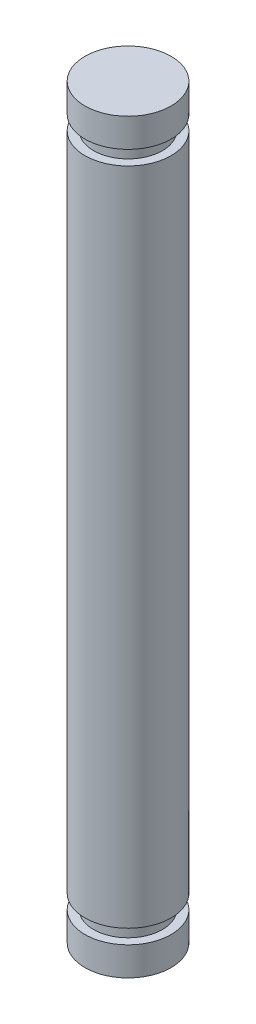
ISO-10303-21;
HEADER;
FILE_DESCRIPTION(('STEP AP214'),'2;1');
FILE_NAME('part.step','',(''),(''),'','','');
FILE_SCHEMA(('AUTOMOTIVE_DESIGN { 1 0 10303 214 1 1 1 1 }'));
ENDSEC;
DATA;
#1=APPLICATION_CONTEXT('core data for automotive mechanical design processes');
#2=APPLICATION_PROTOCOL_DEFINITION('international standard','automotive_design',2000,#1);
#3=PRODUCT_CONTEXT('',#1,'mechanical');
#4=PRODUCT('Part','Part','',(#3));
#5=PRODUCT_RELATED_PRODUCT_CATEGORY('part','',(#4));
#6=PRODUCT_DEFINITION_FORMATION('','',#4);
#7=PRODUCT_DEFINITION_CONTEXT('part definition',#1,'design');
#8=PRODUCT_DEFINITION('design','',#6,#7);
#9=PRODUCT_DEFINITION_SHAPE('','',#8);
#10=(LENGTH_UNIT() NAMED_UNIT(*) SI_UNIT(.MILLI.,.METRE.));
#11=(NAMED_UNIT(*) PLANE_ANGLE_UNIT() SI_UNIT($,.RADIAN.));
#12=(NAMED_UNIT(*) SI_UNIT($,.STERADIAN.) SOLID_ANGLE_UNIT());
#13=UNCERTAINTY_MEASURE_WITH_UNIT(LENGTH_MEASURE(1.E-05),#10,'distance_accuracy_value','');
#14=(GEOMETRIC_REPRESENTATION_CONTEXT(3) GLOBAL_UNCERTAINTY_ASSIGNED_CONTEXT((#13)) GLOBAL_UNIT_ASSIGNED_CONTEXT((#10,
#11,#12)) REPRESENTATION_CONTEXT('',''));
#15=CARTESIAN_POINT('',(0.,0.,0.));
#16=DIRECTION('',(0.,0.,1.));
#17=DIRECTION('',(1.,0.,0.));
#18=AXIS2_PLACEMENT_3D('',#15,#16,#17);
#19=CARTESIAN_POINT('',(0.,26.,0.));
#20=DIRECTION('',(0.,-1.,0.));
#21=DIRECTION('',(0.,0.,-1.));
#22=AXIS2_PLACEMENT_3D('',#19,#20,#21);
#23=CYLINDRICAL_SURFACE('',#22,1.5);
#24=CARTESIAN_POINT('',(0.,1.5,0.));
#25=DIRECTION('',(0.,-1.,0.));
#26=DIRECTION('',(0.,0.,-1.));
#27=AXIS2_PLACEMENT_3D('',#24,#25,#26);
#28=CIRCLE('',#27,1.5);
#29=CARTESIAN_POINT('',(0.,1.5,-1.5));
#30=VERTEX_POINT('',#29);
#31=EDGE_CURVE('E58',#30,#30,#28,.T.);
#32=CARTESIAN_POINT('',(0.,24.5,0.));
#33=DIRECTION('',(0.,1.,0.));
#34=DIRECTION('',(0.,0.,1.));
#35=AXIS2_PLACEMENT_3D('',#32,#33,#34);
#36=CIRCLE('',#35,1.5);
#37=CARTESIAN_POINT('',(0.,24.5,-1.5));
#38=VERTEX_POINT('',#37);
#39=EDGE_CURVE('E49',#38,#38,#36,.T.);
#40=CARTESIAN_POINT('',(0.,1.5,-1.5));
#41=CARTESIAN_POINT('',(0.,1.73958333333334,-1.5));
#42=CARTESIAN_POINT('',(0.,1.97916666666667,-1.5));
#43=CARTESIAN_POINT('',(0.,2.45833333333334,-1.5));
#44=CARTESIAN_POINT('',(0.,2.69791666666667,-1.5));
#45=CARTESIAN_POINT('',(0.,3.17708333333334,-1.5));
#46=CARTESIAN_POINT('',(0.,3.41666666666667,-1.5));
#47=CARTESIAN_POINT('',(0.,3.89583333333333,-1.5));
#48=CARTESIAN_POINT('',(0.,4.13541666666667,-1.5));
#49=CARTESIAN_POINT('',(0.,4.61458333333333,-1.5));
#50=CARTESIAN_POINT('',(0.,4.85416666666667,-1.5));
#51=CARTESIAN_POINT('',(0.,5.33333333333333,-1.5));
#52=CARTESIAN_POINT('',(0.,5.57291666666667,-1.5));
#53=CARTESIAN_POINT('',(0.,6.05208333333334,-1.5));
#54=CARTESIAN_POINT('',(0.,6.29166666666667,-1.5));
#55=CARTESIAN_POINT('',(0.,6.77083333333333,-1.5));
#56=CARTESIAN_POINT('',(0.,7.01041666666667,-1.5));
#57=CARTESIAN_POINT('',(0.,7.48958333333333,-1.5));
#58=CARTESIAN_POINT('',(0.,7.72916666666667,-1.5));
#59=CARTESIAN_POINT('',(0.,8.20833333333333,-1.5));
#60=CARTESIAN_POINT('',(0.,8.44791666666667,-1.5));
#61=CARTESIAN_POINT('',(0.,8.92708333333333,-1.5));
#62=CARTESIAN_POINT('',(0.,9.16666666666667,-1.5));
#63=CARTESIAN_POINT('',(0.,9.64583333333333,-1.5));
#64=CARTESIAN_POINT('',(0.,9.88541666666667,-1.5));
#65=CARTESIAN_POINT('',(0.,10.3645833333333,-1.5));
#66=CARTESIAN_POINT('',(0.,10.6041666666667,-1.5));
#67=CARTESIAN_POINT('',(0.,11.0833333333333,-1.5));
#68=CARTESIAN_POINT('',(0.,11.3229166666667,-1.5));
#69=CARTESIAN_POINT('',(0.,11.8020833333333,-1.5));
#70=CARTESIAN_POINT('',(0.,12.0416666666667,-1.5));
#71=CARTESIAN_POINT('',(0.,12.5208333333333,-1.5));
#72=CARTESIAN_POINT('',(0.,12.7604166666667,-1.5));
#73=CARTESIAN_POINT('',(0.,13.2395833333333,-1.5));
#74=CARTESIAN_POINT('',(0.,13.4791666666667,-1.5));
#75=CARTESIAN_POINT('',(0.,13.9583333333333,-1.5));
#76=CARTESIAN_POINT('',(0.,14.1979166666667,-1.5));
#77=CARTESIAN_POINT('',(0.,14.6770833333333,-1.5));
#78=CARTESIAN_POINT('',(0.,14.9166666666667,-1.5));
#79=CARTESIAN_POINT('',(0.,15.3958333333333,-1.5));
#80=CARTESIAN_POINT('',(0.,15.6354166666667,-1.5));
#81=CARTESIAN_POINT('',(0.,16.1145833333333,-1.5));
#82=CARTESIAN_POINT('',(0.,16.3541666666667,-1.5));
#83=CARTESIAN_POINT('',(0.,16.8333333333333,-1.5));
#84=CARTESIAN_POINT('',(0.,17.0729166666667,-1.5));
#85=CARTESIAN_POINT('',(0.,17.5520833333333,-1.5));
#86=CARTESIAN_POINT('',(0.,17.7916666666667,-1.5));
#87=CARTESIAN_POINT('',(0.,18.2708333333333,-1.5));
#88=CARTESIAN_POINT('',(0.,18.5104166666667,-1.5));
#89=CARTESIAN_POINT('',(0.,18.9895833333333,-1.5));
#90=CARTESIAN_POINT('',(0.,19.2291666666667,-1.5));
#91=CARTESIAN_POINT('',(0.,19.7083333333333,-1.5));
#92=CARTESIAN_POINT('',(0.,19.9479166666667,-1.5));
#93=CARTESIAN_POINT('',(0.,20.4270833333333,-1.5));
#94=CARTESIAN_POINT('',(0.,20.6666666666667,-1.5));
#95=CARTESIAN_POINT('',(0.,21.1458333333333,-1.5));
#96=CARTESIAN_POINT('',(0.,21.3854166666667,-1.5));
#97=CARTESIAN_POINT('',(0.,21.8645833333333,-1.5));
#98=CARTESIAN_POINT('',(0.,22.1041666666667,-1.5));
#99=CARTESIAN_POINT('',(0.,22.5833333333333,-1.5));
#100=CARTESIAN_POINT('',(0.,22.8229166666667,-1.5));
#101=CARTESIAN_POINT('',(0.,23.3020833333333,-1.5));
#102=CARTESIAN_POINT('',(0.,23.5416666666667,-1.5));
#103=CARTESIAN_POINT('',(0.,24.0208333333333,-1.5));
#104=CARTESIAN_POINT('',(0.,24.2604166666667,-1.5));
#105=CARTESIAN_POINT('',(0.,24.5,-1.5));
#106=B_SPLINE_CURVE_WITH_KNOTS('',3,(#40,#41,#42,#43,#44,#45,#46,#47,#48,#49,#50,#51,#52,#53,
#54,#55,#56,#57,#58,#59,#60,#61,#62,#63,#64,#65,#66,#67,#68,#69,#70,#71,#72,#73,#74,#75,#76,#77,
#78,#79,#80,#81,#82,#83,#84,#85,#86,#87,#88,#89,#90,#91,#92,#93,#94,#95,#96,#97,#98,#99,#100,
#101,#102,#103,#104,#105),.UNSPECIFIED.,.F.,.F.,(4,2,2,2,2,2,2,2,2,2,2,2,2,2,2,2,2,2,2,2,2,2,2,
2,2,2,2,2,2,2,2,2,4),(0.,0.718750000000001,1.4375,2.15625,2.875,3.59375,4.3125,5.03125,5.75,
6.46875,7.1875,7.90625,8.625,9.34375,10.0625,10.78125,11.5,12.21875,12.9375,13.65625,14.375,
15.09375,15.8125,16.53125,17.25,17.96875,18.6875,19.40625,20.125,20.84375,21.5625,22.28125,23.),.UNSPECIFIED.);
#107=EDGE_CURVE('BSEAM46',#30,#38,#106,.T.);
#108=ORIENTED_EDGE('',*,*,#31,.F.);
#109=ORIENTED_EDGE('',*,*,#39,.F.);
#110=ORIENTED_EDGE('',*,*,#107,.T.);
#111=ORIENTED_EDGE('',*,*,#107,.F.);
#112=EDGE_LOOP('',(#108,#110,#109,#111));
#113=FACE_BOUND('',#112,.T.);
#114=ADVANCED_FACE('F46',(#113),#23,.T.);
#115=CARTESIAN_POINT('',(0.,1.5,1.2));
#116=DIRECTION('',(0.,-1.,0.));
#117=DIRECTION('',(0.,0.,-1.));
#118=AXIS2_PLACEMENT_3D('',#115,#116,#117);
#119=PLANE('',#118);
#120=CARTESIAN_POINT('',(0.,1.5,0.));
#121=DIRECTION('',(0.,-1.,0.));
#122=DIRECTION('',(0.,0.,-1.));
#123=AXIS2_PLACEMENT_3D('',#120,#121,#122);
#124=CIRCLE('',#123,1.2);
#125=CARTESIAN_POINT('',(0.,1.5,-1.2));
#126=VERTEX_POINT('',#125);
#127=EDGE_CURVE('E61',#126,#126,#124,.T.);
#128=ORIENTED_EDGE('',*,*,#127,.F.);
#129=EDGE_LOOP('',(#128));
#130=FACE_BOUND('',#129,.T.);
#131=ORIENTED_EDGE('',*,*,#31,.T.);
#132=EDGE_LOOP('',(#131));
#133=FACE_BOUND('',#132,.T.);
#134=ADVANCED_FACE('F91',(#130,#133),#119,.T.);
#135=CARTESIAN_POINT('',(0.,1.,1.2));
#136=DIRECTION('',(0.,1.,0.));
#137=DIRECTION('',(0.,0.,1.));
#138=AXIS2_PLACEMENT_3D('',#135,#136,#137);
#139=PLANE('',#138);
#140=CARTESIAN_POINT('',(0.,1.,0.));
#141=DIRECTION('',(0.,-1.,0.));
#142=DIRECTION('',(0.,0.,-1.));
#143=AXIS2_PLACEMENT_3D('',#140,#141,#142);
#144=CIRCLE('',#143,1.2);
#145=CARTESIAN_POINT('',(0.,1.,-1.2));
#146=VERTEX_POINT('',#145);
#147=EDGE_CURVE('E74',#146,#146,#144,.T.);
#148=ORIENTED_EDGE('',*,*,#147,.T.);
#149=EDGE_LOOP('',(#148));
#150=FACE_BOUND('',#149,.T.);
#151=CARTESIAN_POINT('',(0.,1.,0.));
#152=DIRECTION('',(0.,1.,0.));
#153=DIRECTION('',(0.,0.,1.));
#154=AXIS2_PLACEMENT_3D('',#151,#152,#153);
#155=CIRCLE('',#154,1.5);
#156=CARTESIAN_POINT('',(0.,1.,-1.5));
#157=VERTEX_POINT('',#156);
#158=EDGE_CURVE('E64',#157,#157,#155,.T.);
#159=ORIENTED_EDGE('',*,*,#158,.T.);
#160=EDGE_LOOP('',(#159));
#161=FACE_BOUND('',#160,.T.);
#162=ADVANCED_FACE('F94',(#150,#161),#139,.T.);
#163=CARTESIAN_POINT('',(0.,0.,0.));
#164=DIRECTION('',(0.,-1.,0.));
#165=DIRECTION('',(0.,0.,-1.));
#166=AXIS2_PLACEMENT_3D('',#163,#164,#165);
#167=CYLINDRICAL_SURFACE('',#166,1.2);
#168=ORIENTED_EDGE('',*,*,#127,.T.);
#169=EDGE_LOOP('',(#168));
#170=FACE_BOUND('',#169,.T.);
#171=ORIENTED_EDGE('',*,*,#147,.F.);
#172=EDGE_LOOP('',(#171));
#173=FACE_BOUND('',#172,.T.);
#174=ADVANCED_FACE('F88',(#170,#173),#167,.T.);
#175=CARTESIAN_POINT('',(0.,0.,0.));
#176=DIRECTION('',(0.,1.,0.));
#177=DIRECTION('',(0.,0.,1.));
#178=AXIS2_PLACEMENT_3D('',#175,#176,#177);
#179=PLANE('',#178);
#180=CARTESIAN_POINT('',(0.,0.,0.));
#181=DIRECTION('',(0.,1.,0.));
#182=DIRECTION('',(0.,0.,1.));
#183=AXIS2_PLACEMENT_3D('',#180,#181,#182);
#184=CIRCLE('',#183,1.5);
#185=CARTESIAN_POINT('',(0.,0.,-1.5));
#186=VERTEX_POINT('',#185);
#187=EDGE_CURVE('E53',#186,#186,#184,.T.);
#188=ORIENTED_EDGE('',*,*,#187,.F.);
#189=EDGE_LOOP('',(#188));
#190=FACE_BOUND('',#189,.T.);
#191=ADVANCED_FACE('F115',(#190),#179,.F.);
#192=CARTESIAN_POINT('',(0.,0.,-1.5));
#193=CARTESIAN_POINT('',(0.,0.0104166666666667,-1.5));
#194=CARTESIAN_POINT('',(0.,0.0208333333333333,-1.5));
#195=CARTESIAN_POINT('',(0.,0.0416666666666667,-1.5));
#196=CARTESIAN_POINT('',(0.,0.0520833333333334,-1.5));
#197=CARTESIAN_POINT('',(0.,0.0729166666666667,-1.5));
#198=CARTESIAN_POINT('',(0.,0.0833333333333334,-1.5));
#199=CARTESIAN_POINT('',(0.,0.104166666666667,-1.5));
#200=CARTESIAN_POINT('',(0.,0.114583333333333,-1.5));
#201=CARTESIAN_POINT('',(0.,0.135416666666667,-1.5));
#202=CARTESIAN_POINT('',(0.,0.145833333333333,-1.5));
#203=CARTESIAN_POINT('',(0.,0.166666666666667,-1.5));
#204=CARTESIAN_POINT('',(0.,0.177083333333333,-1.5));
#205=CARTESIAN_POINT('',(0.,0.197916666666667,-1.5));
#206=CARTESIAN_POINT('',(0.,0.208333333333334,-1.5));
#207=CARTESIAN_POINT('',(0.,0.229166666666667,-1.5));
#208=CARTESIAN_POINT('',(0.,0.239583333333334,-1.5));
#209=CARTESIAN_POINT('',(0.,0.260416666666667,-1.5));
#210=CARTESIAN_POINT('',(0.,0.270833333333334,-1.5));
#211=CARTESIAN_POINT('',(0.,0.291666666666667,-1.5));
#212=CARTESIAN_POINT('',(0.,0.302083333333334,-1.5));
#213=CARTESIAN_POINT('',(0.,0.322916666666667,-1.5));
#214=CARTESIAN_POINT('',(0.,0.333333333333334,-1.5));
#215=CARTESIAN_POINT('',(0.,0.354166666666667,-1.5));
#216=CARTESIAN_POINT('',(0.,0.364583333333334,-1.5));
#217=CARTESIAN_POINT('',(0.,0.385416666666667,-1.5));
#218=CARTESIAN_POINT('',(0.,0.395833333333334,-1.5));
#219=CARTESIAN_POINT('',(0.,0.416666666666667,-1.5));
#220=CARTESIAN_POINT('',(0.,0.427083333333334,-1.5));
#221=CARTESIAN_POINT('',(0.,0.447916666666667,-1.5));
#222=CARTESIAN_POINT('',(0.,0.458333333333334,-1.5));
#223=CARTESIAN_POINT('',(0.,0.479166666666667,-1.5));
#224=CARTESIAN_POINT('',(0.,0.489583333333334,-1.5));
#225=CARTESIAN_POINT('',(0.,0.510416666666667,-1.5));
#226=CARTESIAN_POINT('',(0.,0.520833333333334,-1.5));
#227=CARTESIAN_POINT('',(0.,0.541666666666667,-1.5));
#228=CARTESIAN_POINT('',(0.,0.552083333333334,-1.5));
#229=CARTESIAN_POINT('',(0.,0.572916666666667,-1.5));
#230=CARTESIAN_POINT('',(0.,0.583333333333334,-1.5));
#231=CARTESIAN_POINT('',(0.,0.604166666666667,-1.5));
#232=CARTESIAN_POINT('',(0.,0.614583333333334,-1.5));
#233=CARTESIAN_POINT('',(0.,0.635416666666667,-1.5));
#234=CARTESIAN_POINT('',(0.,0.645833333333334,-1.5));
#235=CARTESIAN_POINT('',(0.,0.666666666666667,-1.5));
#236=CARTESIAN_POINT('',(0.,0.677083333333334,-1.5));
#237=CARTESIAN_POINT('',(0.,0.697916666666667,-1.5));
#238=CARTESIAN_POINT('',(0.,0.708333333333334,-1.5));
#239=CARTESIAN_POINT('',(0.,0.729166666666667,-1.5));
#240=CARTESIAN_POINT('',(0.,0.739583333333334,-1.5));
#241=CARTESIAN_POINT('',(0.,0.760416666666667,-1.5));
#242=CARTESIAN_POINT('',(0.,0.770833333333334,-1.5));
#243=CARTESIAN_POINT('',(0.,0.791666666666667,-1.5));
#244=CARTESIAN_POINT('',(0.,0.802083333333334,-1.5));
#245=CARTESIAN_POINT('',(0.,0.822916666666667,-1.5));
#246=CARTESIAN_POINT('',(0.,0.833333333333334,-1.5));
#247=CARTESIAN_POINT('',(0.,0.854166666666667,-1.5));
#248=CARTESIAN_POINT('',(0.,0.864583333333334,-1.5));
#249=CARTESIAN_POINT('',(0.,0.885416666666668,-1.5));
#250=CARTESIAN_POINT('',(0.,0.895833333333334,-1.5));
#251=CARTESIAN_POINT('',(0.,0.916666666666668,-1.5));
#252=CARTESIAN_POINT('',(0.,0.927083333333334,-1.5));
#253=CARTESIAN_POINT('',(0.,0.947916666666668,-1.5));
#254=CARTESIAN_POINT('',(0.,0.958333333333334,-1.5));
#255=CARTESIAN_POINT('',(0.,0.979166666666668,-1.5));
#256=CARTESIAN_POINT('',(0.,0.989583333333334,-1.5));
#257=CARTESIAN_POINT('',(0.,1.,-1.5));
#258=B_SPLINE_CURVE_WITH_KNOTS('',3,(#192,#193,#194,#195,#196,#197,#198,#199,#200,#201,#202,
#203,#204,#205,#206,#207,#208,#209,#210,#211,#212,#213,#214,#215,#216,#217,#218,#219,#220,#221,
#222,#223,#224,#225,#226,#227,#228,#229,#230,#231,#232,#233,#234,#235,#236,#237,#238,#239,#240,
#241,#242,#243,#244,#245,#246,#247,#248,#249,#250,#251,#252,#253,#254,#255,#256,#257),
.UNSPECIFIED.,.F.,.F.,(4,2,2,2,2,2,2,2,2,2,2,2,2,2,2,2,2,2,2,2,2,2,2,2,2,2,2,2,2,2,2,2,4),(0.,
0.03125,0.0625000000000001,0.0937500000000001,0.125,0.15625,0.1875,0.21875,0.25,0.28125,0.3125,
0.34375,0.375,0.40625,0.4375,0.46875,0.5,0.53125,0.5625,0.593750000000001,0.625000000000001,
0.656250000000001,0.687500000000001,0.718750000000001,0.750000000000001,0.781250000000001,
0.812500000000001,0.843750000000001,0.875000000000001,0.906250000000001,0.937500000000001,
0.968750000000001,1.),.UNSPECIFIED.);
#259=EDGE_CURVE('BSEAM101',#186,#157,#258,.T.);
#260=ORIENTED_EDGE('',*,*,#187,.T.);
#261=ORIENTED_EDGE('',*,*,#158,.F.);
#262=ORIENTED_EDGE('',*,*,#259,.T.);
#263=ORIENTED_EDGE('',*,*,#259,.F.);
#264=EDGE_LOOP('',(#260,#262,#261,#263));
#265=FACE_BOUND('',#264,.T.);
#266=ADVANCED_FACE('F101',(#265),#23,.T.);
#267=CARTESIAN_POINT('',(0.,24.5,1.2));
#268=DIRECTION('',(0.,1.,0.));
#269=DIRECTION('',(0.,0.,-1.));
#270=AXIS2_PLACEMENT_3D('',#267,#268,#269);
#271=PLANE('',#270);
#272=CARTESIAN_POINT('',(0.,24.5,0.));
#273=DIRECTION('',(0.,-1.,0.));
#274=DIRECTION('',(0.,0.,-1.));
#275=AXIS2_PLACEMENT_3D('',#272,#273,#274);
#276=CIRCLE('',#275,1.2);
#277=CARTESIAN_POINT('',(0.,24.5,-1.2));
#278=VERTEX_POINT('',#277);
#279=EDGE_CURVE('E70',#278,#278,#276,.T.);
#280=ORIENTED_EDGE('',*,*,#279,.T.);
#281=EDGE_LOOP('',(#280));
#282=FACE_BOUND('',#281,.T.);
#283=ORIENTED_EDGE('',*,*,#39,.T.);
#284=EDGE_LOOP('',(#283));
#285=FACE_BOUND('',#284,.T.);
#286=ADVANCED_FACE('F104',(#282,#285),#271,.T.);
#287=CARTESIAN_POINT('',(0.,25.,1.2));
#288=DIRECTION('',(0.,-1.,0.));
#289=DIRECTION('',(0.,0.,1.));
#290=AXIS2_PLACEMENT_3D('',#287,#288,#289);
#291=PLANE('',#290);
#292=CARTESIAN_POINT('',(0.,25.,0.));
#293=DIRECTION('',(0.,-1.,0.));
#294=DIRECTION('',(0.,0.,-1.));
#295=AXIS2_PLACEMENT_3D('',#292,#293,#294);
#296=CIRCLE('',#295,1.2);
#297=CARTESIAN_POINT('',(0.,25.,-1.2));
#298=VERTEX_POINT('',#297);
#299=EDGE_CURVE('E76',#298,#298,#296,.T.);
#300=ORIENTED_EDGE('',*,*,#299,.F.);
#301=EDGE_LOOP('',(#300));
#302=FACE_BOUND('',#301,.T.);
#303=CARTESIAN_POINT('',(0.,25.,0.));
#304=DIRECTION('',(0.,-1.,0.));
#305=DIRECTION('',(0.,0.,-1.));
#306=AXIS2_PLACEMENT_3D('',#303,#304,#305);
#307=CIRCLE('',#306,1.5);
#308=CARTESIAN_POINT('',(0.,25.,-1.5));
#309=VERTEX_POINT('',#308);
#310=EDGE_CURVE('E68',#309,#309,#307,.T.);
#311=ORIENTED_EDGE('',*,*,#310,.T.);
#312=EDGE_LOOP('',(#311));
#313=FACE_BOUND('',#312,.T.);
#314=ADVANCED_FACE('F106',(#302,#313),#291,.T.);
#315=CARTESIAN_POINT('',(0.,26.,0.));
#316=DIRECTION('',(0.,1.,0.));
#317=DIRECTION('',(0.,0.,-1.));
#318=AXIS2_PLACEMENT_3D('',#315,#316,#317);
#319=CYLINDRICAL_SURFACE('',#318,1.2);
#320=ORIENTED_EDGE('',*,*,#279,.F.);
#321=EDGE_LOOP('',(#320));
#322=FACE_BOUND('',#321,.T.);
#323=ORIENTED_EDGE('',*,*,#299,.T.);
#324=EDGE_LOOP('',(#323));
#325=FACE_BOUND('',#324,.T.);
#326=ADVANCED_FACE('F112',(#322,#325),#319,.T.);
#327=CARTESIAN_POINT('',(0.,26.,0.));
#328=DIRECTION('',(0.,1.,0.));
#329=DIRECTION('',(0.,0.,1.));
#330=AXIS2_PLACEMENT_3D('',#327,#328,#329);
#331=PLANE('',#330);
#332=CARTESIAN_POINT('',(0.,26.,0.));
#333=DIRECTION('',(0.,1.,0.));
#334=DIRECTION('',(0.,0.,1.));
#335=AXIS2_PLACEMENT_3D('',#332,#333,#334);
#336=CIRCLE('',#335,1.5);
#337=CARTESIAN_POINT('',(0.,26.,-1.5));
#338=VERTEX_POINT('',#337);
#339=EDGE_CURVE('E12',#338,#338,#336,.T.);
#340=ORIENTED_EDGE('',*,*,#339,.T.);
#341=EDGE_LOOP('',(#340));
#342=FACE_BOUND('',#341,.T.);
#343=ADVANCED_FACE('F120',(#342),#331,.T.);
#344=CARTESIAN_POINT('',(0.,26.,-1.5));
#345=CARTESIAN_POINT('',(0.,25.9895833333333,-1.5));
#346=CARTESIAN_POINT('',(0.,25.9791666666667,-1.5));
#347=CARTESIAN_POINT('',(0.,25.9583333333333,-1.5));
#348=CARTESIAN_POINT('',(0.,25.9479166666667,-1.5));
#349=CARTESIAN_POINT('',(0.,25.9270833333333,-1.5));
#350=CARTESIAN_POINT('',(0.,25.9166666666667,-1.5));
#351=CARTESIAN_POINT('',(0.,25.8958333333333,-1.5));
#352=CARTESIAN_POINT('',(0.,25.8854166666667,-1.5));
#353=CARTESIAN_POINT('',(0.,25.8645833333333,-1.5));
#354=CARTESIAN_POINT('',(0.,25.8541666666667,-1.5));
#355=CARTESIAN_POINT('',(0.,25.8333333333333,-1.5));
#356=CARTESIAN_POINT('',(0.,25.8229166666667,-1.5));
#357=CARTESIAN_POINT('',(0.,25.8020833333333,-1.5));
#358=CARTESIAN_POINT('',(0.,25.7916666666667,-1.5));
#359=CARTESIAN_POINT('',(0.,25.7708333333333,-1.5));
#360=CARTESIAN_POINT('',(0.,25.7604166666667,-1.5));
#361=CARTESIAN_POINT('',(0.,25.7395833333333,-1.5));
#362=CARTESIAN_POINT('',(0.,25.7291666666667,-1.5));
#363=CARTESIAN_POINT('',(0.,25.7083333333333,-1.5));
#364=CARTESIAN_POINT('',(0.,25.6979166666667,-1.5));
#365=CARTESIAN_POINT('',(0.,25.6770833333333,-1.5));
#366=CARTESIAN_POINT('',(0.,25.6666666666667,-1.5));
#367=CARTESIAN_POINT('',(0.,25.6458333333333,-1.5));
#368=CARTESIAN_POINT('',(0.,25.6354166666667,-1.5));
#369=CARTESIAN_POINT('',(0.,25.6145833333333,-1.5));
#370=CARTESIAN_POINT('',(0.,25.6041666666667,-1.5));
#371=CARTESIAN_POINT('',(0.,25.5833333333333,-1.5));
#372=CARTESIAN_POINT('',(0.,25.5729166666667,-1.5));
#373=CARTESIAN_POINT('',(0.,25.5520833333333,-1.5));
#374=CARTESIAN_POINT('',(0.,25.5416666666667,-1.5));
#375=CARTESIAN_POINT('',(0.,25.5208333333333,-1.5));
#376=CARTESIAN_POINT('',(0.,25.5104166666667,-1.5));
#377=CARTESIAN_POINT('',(0.,25.4895833333333,-1.5));
#378=CARTESIAN_POINT('',(0.,25.4791666666667,-1.5));
#379=CARTESIAN_POINT('',(0.,25.4583333333333,-1.5));
#380=CARTESIAN_POINT('',(0.,25.4479166666667,-1.5));
#381=CARTESIAN_POINT('',(0.,25.4270833333333,-1.5));
#382=CARTESIAN_POINT('',(0.,25.4166666666667,-1.5));
#383=CARTESIAN_POINT('',(0.,25.3958333333333,-1.5));
#384=CARTESIAN_POINT('',(0.,25.3854166666667,-1.5));
#385=CARTESIAN_POINT('',(0.,25.3645833333333,-1.5));
#386=CARTESIAN_POINT('',(0.,25.3541666666667,-1.5));
#387=CARTESIAN_POINT('',(0.,25.3333333333333,-1.5));
#388=CARTESIAN_POINT('',(0.,25.3229166666667,-1.5));
#389=CARTESIAN_POINT('',(0.,25.3020833333333,-1.5));
#390=CARTESIAN_POINT('',(0.,25.2916666666667,-1.5));
#391=CARTESIAN_POINT('',(0.,25.2708333333333,-1.5));
#392=CARTESIAN_POINT('',(0.,25.2604166666667,-1.5));
#393=CARTESIAN_POINT('',(0.,25.2395833333333,-1.5));
#394=CARTESIAN_POINT('',(0.,25.2291666666667,-1.5));
#395=CARTESIAN_POINT('',(0.,25.2083333333333,-1.5));
#396=CARTESIAN_POINT('',(0.,25.1979166666667,-1.5));
#397=CARTESIAN_POINT('',(0.,25.1770833333333,-1.5));
#398=CARTESIAN_POINT('',(0.,25.1666666666667,-1.5));
#399=CARTESIAN_POINT('',(0.,25.1458333333333,-1.5));
#400=CARTESIAN_POINT('',(0.,25.1354166666667,-1.5));
#401=CARTESIAN_POINT('',(0.,25.1145833333333,-1.5));
#402=CARTESIAN_POINT('',(0.,25.1041666666667,-1.5));
#403=CARTESIAN_POINT('',(0.,25.0833333333333,-1.5));
#404=CARTESIAN_POINT('',(0.,25.0729166666667,-1.5));
#405=CARTESIAN_POINT('',(0.,25.0520833333333,-1.5));
#406=CARTESIAN_POINT('',(0.,25.0416666666667,-1.5));
#407=CARTESIAN_POINT('',(0.,25.0208333333333,-1.5));
#408=CARTESIAN_POINT('',(0.,25.0104166666667,-1.5));
#409=CARTESIAN_POINT('',(0.,25.,-1.5));
#410=B_SPLINE_CURVE_WITH_KNOTS('',3,(#344,#345,#346,#347,#348,#349,#350,#351,#352,#353,#354,
#355,#356,#357,#358,#359,#360,#361,#362,#363,#364,#365,#366,#367,#368,#369,#370,#371,#372,#373,
#374,#375,#376,#377,#378,#379,#380,#381,#382,#383,#384,#385,#386,#387,#388,#389,#390,#391,#392,
#393,#394,#395,#396,#397,#398,#399,#400,#401,#402,#403,#404,#405,#406,#407,#408,#409),
.UNSPECIFIED.,.F.,.F.,(4,2,2,2,2,2,2,2,2,2,2,2,2,2,2,2,2,2,2,2,2,2,2,2,2,2,2,2,2,2,2,2,4),(0.,
0.0312499999999966,0.0624999999999966,0.0937499999999966,0.124999999999997,0.156249999999997,
0.187499999999997,0.218749999999997,0.249999999999997,0.281249999999997,0.312499999999997,
0.343749999999997,0.374999999999997,0.406249999999997,0.437499999999997,0.468749999999997,
0.499999999999997,0.531249999999997,0.562499999999997,0.593749999999997,0.624999999999997,
0.656249999999997,0.687499999999997,0.718749999999997,0.749999999999997,0.781249999999997,
0.812499999999997,0.843749999999997,0.874999999999997,0.906249999999997,0.937499999999997,
0.968749999999997,0.999999999999997),.UNSPECIFIED.);
#411=EDGE_CURVE('BSEAM100',#338,#309,#410,.T.);
#412=ORIENTED_EDGE('',*,*,#339,.F.);
#413=ORIENTED_EDGE('',*,*,#310,.F.);
#414=ORIENTED_EDGE('',*,*,#411,.T.);
#415=ORIENTED_EDGE('',*,*,#411,.F.);
#416=EDGE_LOOP('',(#412,#414,#413,#415));
#417=FACE_BOUND('',#416,.T.);
#418=ADVANCED_FACE('F100',(#417),#23,.T.);
#419=CLOSED_SHELL('',(#114,#134,#162,#174,#191,#266,#286,#314,#326,#343,#418));
#420=MANIFOLD_SOLID_BREP('B2',#419);
#421=ADVANCED_BREP_SHAPE_REPRESENTATION('',(#18,#420),#14);
#422=SHAPE_DEFINITION_REPRESENTATION(#9,#421);
ENDSEC;
END-ISO-10303-21;
